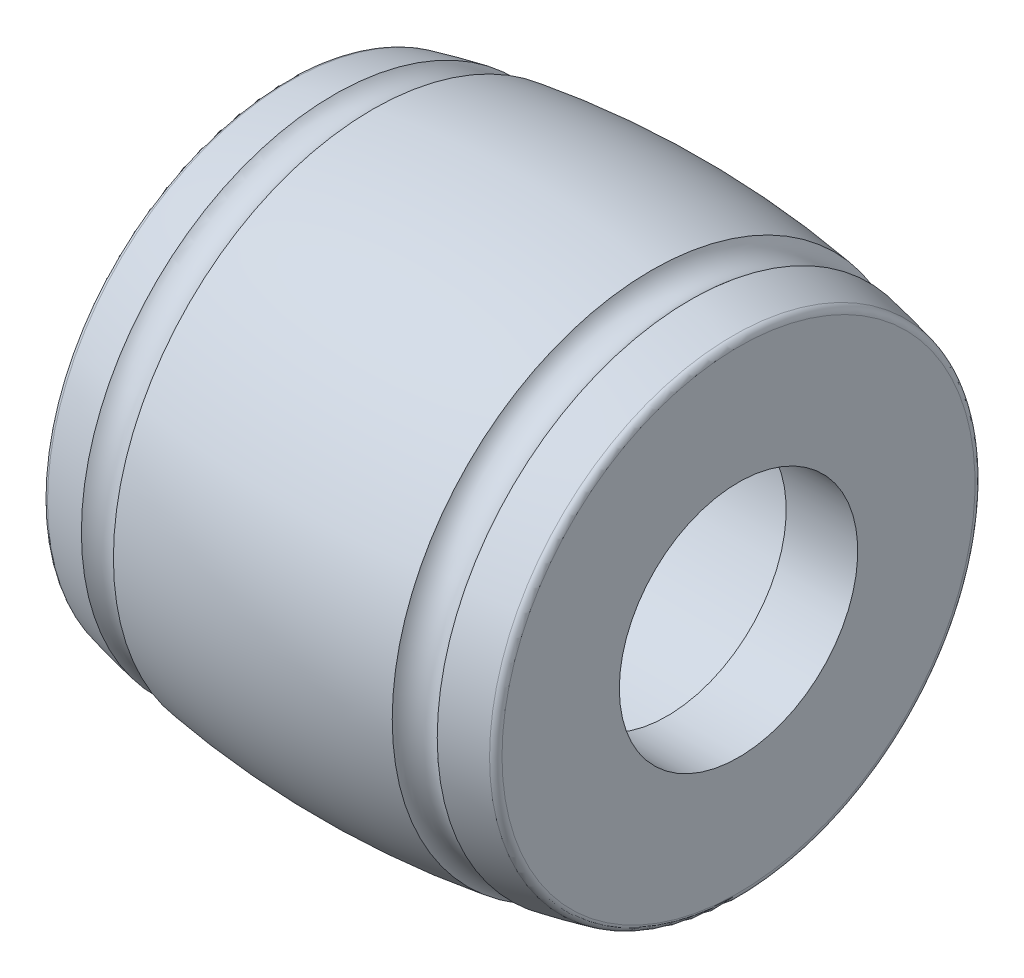
ISO-10303-21;
HEADER;
FILE_DESCRIPTION(('STEP AP214'),'2;1');
FILE_NAME('part.step','',(''),(''),'','','');
FILE_SCHEMA(('AUTOMOTIVE_DESIGN { 1 0 10303 214 1 1 1 1 }'));
ENDSEC;
DATA;
#1=APPLICATION_CONTEXT('core data for automotive mechanical design processes');
#2=APPLICATION_PROTOCOL_DEFINITION('international standard','automotive_design',2000,#1);
#3=PRODUCT_CONTEXT('',#1,'mechanical');
#4=PRODUCT('Part','Part','',(#3));
#5=PRODUCT_RELATED_PRODUCT_CATEGORY('part','',(#4));
#6=PRODUCT_DEFINITION_FORMATION('','',#4);
#7=PRODUCT_DEFINITION_CONTEXT('part definition',#1,'design');
#8=PRODUCT_DEFINITION('design','',#6,#7);
#9=PRODUCT_DEFINITION_SHAPE('','',#8);
#10=(LENGTH_UNIT() NAMED_UNIT(*) SI_UNIT(.MILLI.,.METRE.));
#11=(NAMED_UNIT(*) PLANE_ANGLE_UNIT() SI_UNIT($,.RADIAN.));
#12=(NAMED_UNIT(*) SI_UNIT($,.STERADIAN.) SOLID_ANGLE_UNIT());
#13=UNCERTAINTY_MEASURE_WITH_UNIT(LENGTH_MEASURE(1.E-05),#10,'distance_accuracy_value','');
#14=(GEOMETRIC_REPRESENTATION_CONTEXT(3) GLOBAL_UNCERTAINTY_ASSIGNED_CONTEXT((#13)) GLOBAL_UNIT_ASSIGNED_CONTEXT((#10,
#11,#12)) REPRESENTATION_CONTEXT('',''));
#15=CARTESIAN_POINT('',(0.,0.,0.));
#16=DIRECTION('',(0.,0.,1.));
#17=DIRECTION('',(1.,0.,0.));
#18=AXIS2_PLACEMENT_3D('',#15,#16,#17);
#19=CARTESIAN_POINT('',(0.,0.,0.));
#20=DIRECTION('',(-1.,0.,0.));
#21=DIRECTION('',(0.,0.,1.));
#22=AXIS2_PLACEMENT_3D('',#19,#20,#21);
#23=PLANE('',#22);
#24=CARTESIAN_POINT('',(0.,0.,0.));
#25=DIRECTION('',(-1.,0.,0.));
#26=DIRECTION('',(0.,0.,1.));
#27=AXIS2_PLACEMENT_3D('',#24,#25,#26);
#28=CIRCLE('',#27,7.);
#29=CARTESIAN_POINT('',(0.,0.,7.));
#30=VERTEX_POINT('',#29);
#31=EDGE_CURVE('E47',#30,#30,#28,.T.);
#32=ORIENTED_EDGE('',*,*,#31,.F.);
#33=EDGE_LOOP('',(#32));
#34=FACE_BOUND('',#33,.T.);
#35=CARTESIAN_POINT('',(0.,0.,0.));
#36=DIRECTION('',(-1.,0.,0.));
#37=DIRECTION('',(0.,0.,1.));
#38=AXIS2_PLACEMENT_3D('',#35,#36,#37);
#39=CIRCLE('',#38,9.9192956952868);
#40=CARTESIAN_POINT('',(0.,0.,9.9192956952868));
#41=VERTEX_POINT('',#40);
#42=EDGE_CURVE('E10',#41,#41,#39,.T.);
#43=ORIENTED_EDGE('',*,*,#42,.T.);
#44=EDGE_LOOP('',(#43));
#45=FACE_BOUND('',#44,.T.);
#46=ADVANCED_FACE('F15',(#34,#45),#23,.T.);
#47=CARTESIAN_POINT('',(0.300000000000036,0.,0.));
#48=DIRECTION('',(-1.,0.,0.));
#49=DIRECTION('',(0.,0.,1.));
#50=AXIS2_PLACEMENT_3D('',#47,#48,#49);
#51=TOROIDAL_SURFACE('',#50,9.91929569528722,0.300000000000038);
#52=CARTESIAN_POINT('',(0.230478662619465,0.,0.));
#53=DIRECTION('',(-1.,0.,0.));
#54=DIRECTION('',(0.,0.,1.));
#55=AXIS2_PLACEMENT_3D('',#52,#53,#54);
#56=CIRCLE('',#55,10.211129181455);
#57=CARTESIAN_POINT('',(0.230478662619465,0.,10.211129181455));
#58=VERTEX_POINT('',#57);
#59=EDGE_CURVE('E21',#58,#58,#56,.T.);
#60=ORIENTED_EDGE('',*,*,#59,.T.);
#61=EDGE_LOOP('',(#60));
#62=FACE_BOUND('',#61,.T.);
#63=ORIENTED_EDGE('',*,*,#42,.F.);
#64=EDGE_LOOP('',(#63));
#65=FACE_BOUND('',#64,.T.);
#66=ADVANCED_FACE('F81',(#62,#65),#51,.T.);
#67=CARTESIAN_POINT('',(9.4999999999501,0.,0.));
#68=DIRECTION('',(-1.,0.,0.));
#69=DIRECTION('',(0.,0.,1.));
#70=AXIS2_PLACEMENT_3D('',#67,#68,#69);
#71=DEGENERATE_TOROIDAL_SURFACE('',#70,28.6999999997676,39.9999999997627,.F.);
#72=CARTESIAN_POINT('',(2.0380015098584,0.,0.));
#73=DIRECTION('',(-1.,0.,0.));
#74=DIRECTION('',(0.,0.,1.));
#75=AXIS2_PLACEMENT_3D('',#72,#73,#74);
#76=CIRCLE('',#75,10.597819004789);
#77=CARTESIAN_POINT('',(2.0380015098584,0.,10.597819004789));
#78=VERTEX_POINT('',#77);
#79=EDGE_CURVE('E25',#78,#78,#76,.T.);
#80=ORIENTED_EDGE('',*,*,#79,.T.);
#81=EDGE_LOOP('',(#80));
#82=FACE_BOUND('',#81,.T.);
#83=ORIENTED_EDGE('',*,*,#59,.F.);
#84=EDGE_LOOP('',(#83));
#85=FACE_BOUND('',#84,.T.);
#86=ADVANCED_FACE('F86',(#82,#85),#71,.F.);
#87=CARTESIAN_POINT('',(2.75000000000021,0.,0.));
#88=DIRECTION('',(-1.,0.,0.));
#89=DIRECTION('',(0.,0.,1.));
#90=AXIS2_PLACEMENT_3D('',#87,#88,#89);
#91=TOROIDAL_SURFACE('',#90,11.3,0.999999999999936);
#92=CARTESIAN_POINT('',(3.65299510983851,0.,0.));
#93=DIRECTION('',(-1.,0.,0.));
#94=DIRECTION('',(0.,0.,1.));
#95=AXIS2_PLACEMENT_3D('',#92,#93,#94);
#96=CIRCLE('',#95,10.870349174785);
#97=CARTESIAN_POINT('',(3.65299510983851,0.,10.870349174785));
#98=VERTEX_POINT('',#97);
#99=EDGE_CURVE('E29',#98,#98,#96,.T.);
#100=ORIENTED_EDGE('',*,*,#99,.T.);
#101=EDGE_LOOP('',(#100));
#102=FACE_BOUND('',#101,.T.);
#103=ORIENTED_EDGE('',*,*,#79,.F.);
#104=EDGE_LOOP('',(#103));
#105=FACE_BOUND('',#104,.T.);
#106=ADVANCED_FACE('F90',(#102,#105),#91,.F.);
#107=CARTESIAN_POINT('',(9.49999999999977,0.,0.));
#108=DIRECTION('',(-1.,0.,0.));
#109=DIRECTION('',(0.,0.,1.));
#110=AXIS2_PLACEMENT_3D('',#107,#108,#109);
#111=DEGENERATE_TOROIDAL_SURFACE('',#110,28.6999999999737,39.9999999999738,.F.);
#112=CARTESIAN_POINT('',(15.347004890161,0.,0.));
#113=DIRECTION('',(-1.,0.,0.));
#114=DIRECTION('',(0.,0.,1.));
#115=AXIS2_PLACEMENT_3D('',#112,#113,#114);
#116=CIRCLE('',#115,10.870349174785);
#117=CARTESIAN_POINT('',(15.347004890161,0.,10.870349174785));
#118=VERTEX_POINT('',#117);
#119=EDGE_CURVE('E34',#118,#118,#116,.T.);
#120=ORIENTED_EDGE('',*,*,#119,.T.);
#121=EDGE_LOOP('',(#120));
#122=FACE_BOUND('',#121,.T.);
#123=ORIENTED_EDGE('',*,*,#99,.F.);
#124=EDGE_LOOP('',(#123));
#125=FACE_BOUND('',#124,.T.);
#126=ADVANCED_FACE('F97',(#122,#125),#111,.F.);
#127=CARTESIAN_POINT('',(16.25,0.,0.));
#128=DIRECTION('',(-1.,0.,0.));
#129=DIRECTION('',(0.,0.,1.));
#130=AXIS2_PLACEMENT_3D('',#127,#128,#129);
#131=TOROIDAL_SURFACE('',#130,11.3000000000008,1.00000000000071);
#132=CARTESIAN_POINT('',(16.961998490142,0.,0.));
#133=DIRECTION('',(-1.,0.,0.));
#134=DIRECTION('',(0.,0.,1.));
#135=AXIS2_PLACEMENT_3D('',#132,#133,#134);
#136=CIRCLE('',#135,10.597819004789);
#137=CARTESIAN_POINT('',(16.961998490142,0.,10.597819004789));
#138=VERTEX_POINT('',#137);
#139=EDGE_CURVE('E37',#138,#138,#136,.T.);
#140=ORIENTED_EDGE('',*,*,#139,.T.);
#141=EDGE_LOOP('',(#140));
#142=FACE_BOUND('',#141,.T.);
#143=ORIENTED_EDGE('',*,*,#119,.F.);
#144=EDGE_LOOP('',(#143));
#145=FACE_BOUND('',#144,.T.);
#146=ADVANCED_FACE('F101',(#142,#145),#131,.F.);
#147=CARTESIAN_POINT('',(9.50000000024646,0.,0.));
#148=DIRECTION('',(-1.,0.,0.));
#149=DIRECTION('',(0.,0.,1.));
#150=AXIS2_PLACEMENT_3D('',#147,#148,#149);
#151=DEGENERATE_TOROIDAL_SURFACE('',#150,28.699999998796,39.9999999987716,.F.);
#152=CARTESIAN_POINT('',(18.769521410579,0.,0.));
#153=DIRECTION('',(-1.,0.,0.));
#154=DIRECTION('',(0.,0.,1.));
#155=AXIS2_PLACEMENT_3D('',#152,#153,#154);
#156=CIRCLE('',#155,10.211129164017);
#157=CARTESIAN_POINT('',(18.769521410579,0.,10.211129164017));
#158=VERTEX_POINT('',#157);
#159=EDGE_CURVE('E40',#158,#158,#156,.T.);
#160=ORIENTED_EDGE('',*,*,#159,.T.);
#161=EDGE_LOOP('',(#160));
#162=FACE_BOUND('',#161,.T.);
#163=ORIENTED_EDGE('',*,*,#139,.F.);
#164=EDGE_LOOP('',(#163));
#165=FACE_BOUND('',#164,.T.);
#166=ADVANCED_FACE('F105',(#162,#165),#151,.F.);
#167=CARTESIAN_POINT('',(18.7000000000014,0.,0.));
#168=DIRECTION('',(-1.,0.,0.));
#169=DIRECTION('',(0.,0.,1.));
#170=AXIS2_PLACEMENT_3D('',#167,#168,#169);
#171=TOROIDAL_SURFACE('',#170,9.91929569528785,0.299999999998654);
#172=CARTESIAN_POINT('',(19.,0.,0.));
#173=DIRECTION('',(-1.,0.,0.));
#174=DIRECTION('',(0.,0.,1.));
#175=AXIS2_PLACEMENT_3D('',#172,#173,#174);
#176=CIRCLE('',#175,9.9192956952868);
#177=CARTESIAN_POINT('',(19.,0.,9.9192956952868));
#178=VERTEX_POINT('',#177);
#179=EDGE_CURVE('E43',#178,#178,#176,.T.);
#180=ORIENTED_EDGE('',*,*,#179,.T.);
#181=EDGE_LOOP('',(#180));
#182=FACE_BOUND('',#181,.T.);
#183=ORIENTED_EDGE('',*,*,#159,.F.);
#184=EDGE_LOOP('',(#183));
#185=FACE_BOUND('',#184,.T.);
#186=ADVANCED_FACE('F109',(#182,#185),#171,.T.);
#187=CARTESIAN_POINT('',(19.,9.9192956952868,0.));
#188=DIRECTION('',(1.,0.,0.));
#189=DIRECTION('',(0.,0.,-1.));
#190=AXIS2_PLACEMENT_3D('',#187,#188,#189);
#191=PLANE('',#190);
#192=CARTESIAN_POINT('',(19.,0.,0.));
#193=DIRECTION('',(-1.,0.,0.));
#194=DIRECTION('',(0.,0.,1.));
#195=AXIS2_PLACEMENT_3D('',#192,#193,#194);
#196=CIRCLE('',#195,5.);
#197=CARTESIAN_POINT('',(19.,0.,5.));
#198=VERTEX_POINT('',#197);
#199=EDGE_CURVE('E50',#198,#198,#196,.T.);
#200=ORIENTED_EDGE('',*,*,#199,.T.);
#201=EDGE_LOOP('',(#200));
#202=FACE_BOUND('',#201,.T.);
#203=ORIENTED_EDGE('',*,*,#179,.F.);
#204=EDGE_LOOP('',(#203));
#205=FACE_BOUND('',#204,.T.);
#206=ADVANCED_FACE('F59',(#202,#205),#191,.T.);
#207=CARTESIAN_POINT('',(16.,0.,0.));
#208=DIRECTION('',(-1.,0.,0.));
#209=DIRECTION('',(0.,0.,1.));
#210=AXIS2_PLACEMENT_3D('',#207,#208,#209);
#211=PLANE('',#210);
#212=CARTESIAN_POINT('',(16.,0.,0.));
#213=DIRECTION('',(-1.,0.,0.));
#214=DIRECTION('',(0.,0.,1.));
#215=AXIS2_PLACEMENT_3D('',#212,#213,#214);
#216=CIRCLE('',#215,5.);
#217=CARTESIAN_POINT('',(16.,0.,5.));
#218=VERTEX_POINT('',#217);
#219=EDGE_CURVE('E53',#218,#218,#216,.T.);
#220=ORIENTED_EDGE('',*,*,#219,.F.);
#221=EDGE_LOOP('',(#220));
#222=FACE_BOUND('',#221,.T.);
#223=CARTESIAN_POINT('',(16.,0.,0.));
#224=DIRECTION('',(-1.,0.,0.));
#225=DIRECTION('',(0.,0.,1.));
#226=AXIS2_PLACEMENT_3D('',#223,#224,#225);
#227=CIRCLE('',#226,7.);
#228=CARTESIAN_POINT('',(16.,0.,7.));
#229=VERTEX_POINT('',#228);
#230=EDGE_CURVE('E46',#229,#229,#227,.T.);
#231=ORIENTED_EDGE('',*,*,#230,.T.);
#232=EDGE_LOOP('',(#231));
#233=FACE_BOUND('',#232,.T.);
#234=ADVANCED_FACE('F69',(#222,#233),#211,.T.);
#235=CARTESIAN_POINT('',(16.,0.,0.));
#236=DIRECTION('',(-1.,0.,0.));
#237=DIRECTION('',(0.,0.,1.));
#238=AXIS2_PLACEMENT_3D('',#235,#236,#237);
#239=CYLINDRICAL_SURFACE('',#238,7.);
#240=ORIENTED_EDGE('',*,*,#230,.F.);
#241=EDGE_LOOP('',(#240));
#242=FACE_BOUND('',#241,.T.);
#243=ORIENTED_EDGE('',*,*,#31,.T.);
#244=EDGE_LOOP('',(#243));
#245=FACE_BOUND('',#244,.T.);
#246=ADVANCED_FACE('F65',(#242,#245),#239,.F.);
#247=CARTESIAN_POINT('',(19.,0.,0.));
#248=DIRECTION('',(-1.,0.,0.));
#249=DIRECTION('',(0.,0.,1.));
#250=AXIS2_PLACEMENT_3D('',#247,#248,#249);
#251=CYLINDRICAL_SURFACE('',#250,5.);
#252=ORIENTED_EDGE('',*,*,#199,.F.);
#253=EDGE_LOOP('',(#252));
#254=FACE_BOUND('',#253,.T.);
#255=ORIENTED_EDGE('',*,*,#219,.T.);
#256=EDGE_LOOP('',(#255));
#257=FACE_BOUND('',#256,.T.);
#258=ADVANCED_FACE('F62',(#254,#257),#251,.F.);
#259=CLOSED_SHELL('',(#46,#66,#86,#106,#126,#146,#166,#186,#206,#234,#246,#258));
#260=MANIFOLD_SOLID_BREP('B1',#259);
#261=ADVANCED_BREP_SHAPE_REPRESENTATION('',(#18,#260),#14);
#262=SHAPE_DEFINITION_REPRESENTATION(#9,#261);
ENDSEC;
END-ISO-10303-21;
